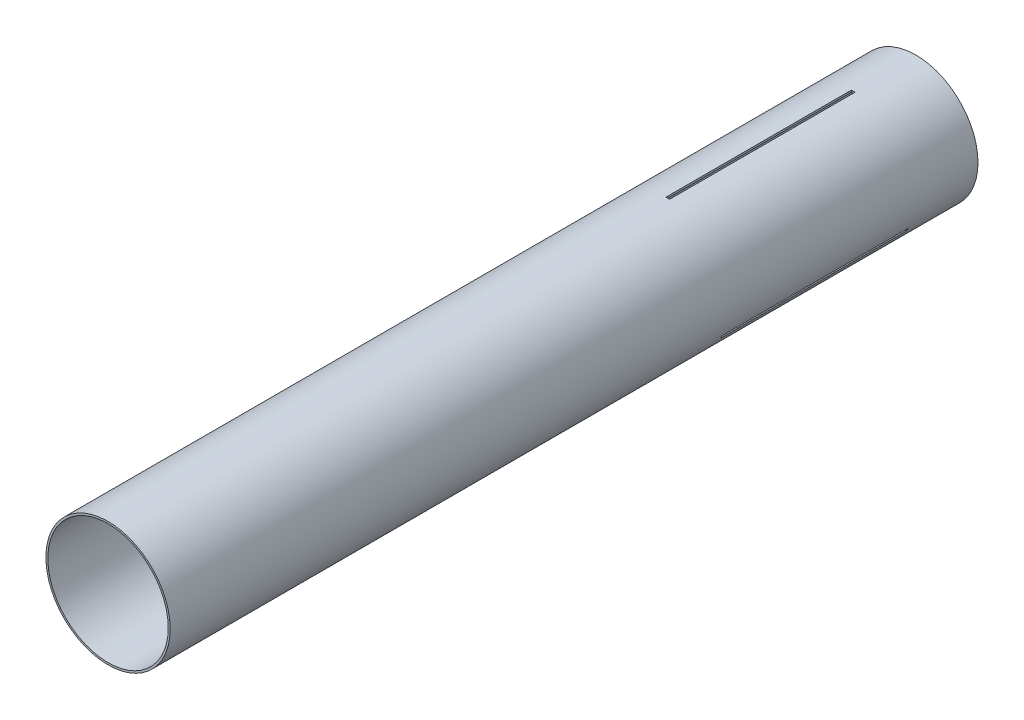
ISO-10303-21;
HEADER;
FILE_DESCRIPTION(('STEP AP214'),'2;1');
FILE_NAME('part.step','',(''),(''),'','','');
FILE_SCHEMA(('AUTOMOTIVE_DESIGN { 1 0 10303 214 1 1 1 1 }'));
ENDSEC;
DATA;
#1=APPLICATION_CONTEXT('core data for automotive mechanical design processes');
#2=APPLICATION_PROTOCOL_DEFINITION('international standard','automotive_design',2000,#1);
#3=PRODUCT_CONTEXT('',#1,'mechanical');
#4=PRODUCT('Part','Part','',(#3));
#5=PRODUCT_RELATED_PRODUCT_CATEGORY('part','',(#4));
#6=PRODUCT_DEFINITION_FORMATION('','',#4);
#7=PRODUCT_DEFINITION_CONTEXT('part definition',#1,'design');
#8=PRODUCT_DEFINITION('design','',#6,#7);
#9=PRODUCT_DEFINITION_SHAPE('','',#8);
#10=(LENGTH_UNIT() NAMED_UNIT(*) SI_UNIT(.MILLI.,.METRE.));
#11=(NAMED_UNIT(*) PLANE_ANGLE_UNIT() SI_UNIT($,.RADIAN.));
#12=(NAMED_UNIT(*) SI_UNIT($,.STERADIAN.) SOLID_ANGLE_UNIT());
#13=UNCERTAINTY_MEASURE_WITH_UNIT(LENGTH_MEASURE(1.E-05),#10,'distance_accuracy_value','');
#14=(GEOMETRIC_REPRESENTATION_CONTEXT(3) GLOBAL_UNCERTAINTY_ASSIGNED_CONTEXT((#13)) GLOBAL_UNIT_ASSIGNED_CONTEXT((#10,
#11,#12)) REPRESENTATION_CONTEXT('',''));
#15=CARTESIAN_POINT('',(0.,0.,0.));
#16=DIRECTION('',(0.,0.,1.));
#17=DIRECTION('',(1.,0.,0.));
#18=AXIS2_PLACEMENT_3D('',#15,#16,#17);
#19=CARTESIAN_POINT('',(0.,0.,660.4));
#20=DIRECTION('',(0.,0.,-1.));
#21=DIRECTION('',(-1.,0.,0.));
#22=AXIS2_PLACEMENT_3D('',#19,#20,#21);
#23=CYLINDRICAL_SURFACE('',#22,50.8);
#24=CARTESIAN_POINT('',(0.,0.,0.));
#25=DIRECTION('',(0.,0.,1.));
#26=DIRECTION('',(1.,0.,0.));
#27=AXIS2_PLACEMENT_3D('',#24,#25,#26);
#28=CIRCLE('',#27,50.8);
#29=CARTESIAN_POINT('',(50.8,0.,0.));
#30=VERTEX_POINT('',#29);
#31=EDGE_CURVE('E178',#30,#30,#28,.T.);
#32=ORIENTED_EDGE('',*,*,#31,.T.);
#33=EDGE_LOOP('',(#32));
#34=FACE_BOUND('',#33,.T.);
#35=CARTESIAN_POINT('',(0.,0.,660.4));
#36=DIRECTION('',(0.,0.,1.));
#37=DIRECTION('',(1.,0.,0.));
#38=AXIS2_PLACEMENT_3D('',#35,#36,#37);
#39=CIRCLE('',#38,50.8);
#40=CARTESIAN_POINT('',(50.8,0.,660.4));
#41=VERTEX_POINT('',#40);
#42=EDGE_CURVE('E181',#41,#41,#39,.T.);
#43=ORIENTED_EDGE('',*,*,#42,.F.);
#44=EDGE_LOOP('',(#43));
#45=FACE_BOUND('',#44,.T.);
#46=DIRECTION('',(0.,0.,-1.));
#47=VECTOR('',#46,1.);
#48=CARTESIAN_POINT('',(-44.7242434170221,-24.0911197492967,660.4));
#49=LINE('',#48,#47);
#50=CARTESIAN_POINT('',(-44.7242434170221,-24.0911197492967,202.8063));
#51=VERTEX_POINT('',#50);
#52=CARTESIAN_POINT('',(-44.7242434170221,-24.0911197492967,51.1937));
#53=VERTEX_POINT('',#52);
#54=EDGE_CURVE('E151',#51,#53,#49,.T.);
#55=ORIENTED_EDGE('',*,*,#54,.F.);
#56=CARTESIAN_POINT('',(0.,0.,202.8063));
#57=DIRECTION('',(0.,0.,1.));
#58=DIRECTION('',(1.,0.,0.));
#59=AXIS2_PLACEMENT_3D('',#56,#57,#58);
#60=CIRCLE('',#59,50.8);
#61=CARTESIAN_POINT('',(-43.2256434170225,-26.6867710895196,202.8063));
#62=VERTEX_POINT('',#61);
#63=EDGE_CURVE('E136',#51,#62,#60,.T.);
#64=ORIENTED_EDGE('',*,*,#63,.T.);
#65=DIRECTION('',(0.,0.,-1.));
#66=VECTOR('',#65,1.);
#67=CARTESIAN_POINT('',(-43.2256434170225,-26.6867710895196,660.4));
#68=LINE('',#67,#66);
#69=CARTESIAN_POINT('',(-43.2256434170225,-26.6867710895196,51.1937));
#70=VERTEX_POINT('',#69);
#71=EDGE_CURVE('E142',#70,#62,#68,.F.);
#72=ORIENTED_EDGE('',*,*,#71,.F.);
#73=CARTESIAN_POINT('',(0.,0.,51.1937));
#74=DIRECTION('',(0.,0.,1.));
#75=DIRECTION('',(1.,0.,0.));
#76=AXIS2_PLACEMENT_3D('',#73,#74,#75);
#77=CIRCLE('',#76,50.8);
#78=EDGE_CURVE('E125',#53,#70,#77,.T.);
#79=ORIENTED_EDGE('',*,*,#78,.F.);
#80=EDGE_LOOP('',(#55,#64,#72,#79));
#81=FACE_BOUND('',#80,.T.);
#82=DIRECTION('',(0.,0.,-1.));
#83=VECTOR('',#82,1.);
#84=CARTESIAN_POINT('',(43.2256434170179,-26.6867710895271,660.4));
#85=LINE('',#84,#83);
#86=CARTESIAN_POINT('',(43.2256434170179,-26.6867710895271,202.8063));
#87=VERTEX_POINT('',#86);
#88=CARTESIAN_POINT('',(43.2256434170179,-26.6867710895271,51.1937));
#89=VERTEX_POINT('',#88);
#90=EDGE_CURVE('E163',#87,#89,#85,.T.);
#91=ORIENTED_EDGE('',*,*,#90,.F.);
#92=CARTESIAN_POINT('',(0.,0.,202.8063));
#93=DIRECTION('',(0.,0.,1.));
#94=DIRECTION('',(1.,0.,0.));
#95=AXIS2_PLACEMENT_3D('',#92,#93,#94);
#96=CIRCLE('',#95,50.8);
#97=CARTESIAN_POINT('',(44.7242434170179,-24.0911197493044,202.8063));
#98=VERTEX_POINT('',#97);
#99=EDGE_CURVE('E158',#87,#98,#96,.T.);
#100=ORIENTED_EDGE('',*,*,#99,.T.);
#101=DIRECTION('',(0.,0.,-1.));
#102=VECTOR('',#101,1.);
#103=CARTESIAN_POINT('',(44.7242434170179,-24.0911197493045,660.4));
#104=LINE('',#103,#102);
#105=CARTESIAN_POINT('',(44.7242434170179,-24.0911197493044,51.1937));
#106=VERTEX_POINT('',#105);
#107=EDGE_CURVE('E161',#106,#98,#104,.F.);
#108=ORIENTED_EDGE('',*,*,#107,.F.);
#109=CARTESIAN_POINT('',(0.,0.,51.1937));
#110=DIRECTION('',(0.,0.,1.));
#111=DIRECTION('',(1.,0.,0.));
#112=AXIS2_PLACEMENT_3D('',#109,#110,#111);
#113=CIRCLE('',#112,50.8);
#114=EDGE_CURVE('E153',#89,#106,#113,.T.);
#115=ORIENTED_EDGE('',*,*,#114,.F.);
#116=EDGE_LOOP('',(#91,#100,#108,#115));
#117=FACE_BOUND('',#116,.T.);
#118=CARTESIAN_POINT('',(0.,0.,202.8063));
#119=DIRECTION('',(0.,0.,-1.));
#120=DIRECTION('',(-1.,0.,0.));
#121=AXIS2_PLACEMENT_3D('',#118,#119,#120);
#122=CIRCLE('',#121,50.8);
#123=CARTESIAN_POINT('',(-1.4986,50.7778908388287,202.8063));
#124=VERTEX_POINT('',#123);
#125=CARTESIAN_POINT('',(1.4986,50.7778908388287,202.8063));
#126=VERTEX_POINT('',#125);
#127=EDGE_CURVE('E168',#124,#126,#122,.T.);
#128=ORIENTED_EDGE('',*,*,#127,.F.);
#129=DIRECTION('',(0.,0.,-1.));
#130=VECTOR('',#129,1.);
#131=CARTESIAN_POINT('',(-1.4986,50.7778908388287,660.4));
#132=LINE('',#131,#130);
#133=CARTESIAN_POINT('',(-1.4986,50.7778908388287,51.1937));
#134=VERTEX_POINT('',#133);
#135=EDGE_CURVE('E172',#134,#124,#132,.F.);
#136=ORIENTED_EDGE('',*,*,#135,.F.);
#137=CARTESIAN_POINT('',(0.,0.,51.1937));
#138=DIRECTION('',(0.,0.,-1.));
#139=DIRECTION('',(-1.,0.,0.));
#140=AXIS2_PLACEMENT_3D('',#137,#138,#139);
#141=CIRCLE('',#140,50.8);
#142=CARTESIAN_POINT('',(1.4986,50.7778908388287,51.1937));
#143=VERTEX_POINT('',#142);
#144=EDGE_CURVE('E165',#134,#143,#141,.T.);
#145=ORIENTED_EDGE('',*,*,#144,.T.);
#146=DIRECTION('',(0.,0.,-1.));
#147=VECTOR('',#146,1.);
#148=CARTESIAN_POINT('',(1.4986,50.7778908388287,660.4));
#149=LINE('',#148,#147);
#150=EDGE_CURVE('E170',#126,#143,#149,.T.);
#151=ORIENTED_EDGE('',*,*,#150,.F.);
#152=EDGE_LOOP('',(#128,#136,#145,#151));
#153=FACE_BOUND('',#152,.T.);
#154=ADVANCED_FACE('F38',(#34,#45,#81,#117,#153),#23,.T.);
#155=CARTESIAN_POINT('',(0.,0.,660.4));
#156=DIRECTION('',(0.,0.,-1.));
#157=DIRECTION('',(-1.,0.,0.));
#158=AXIS2_PLACEMENT_3D('',#155,#156,#157);
#159=CYLINDRICAL_SURFACE('',#158,49.2125);
#160=CARTESIAN_POINT('',(0.,0.,202.8063));
#161=DIRECTION('',(0.,0.,1.));
#162=DIRECTION('',(1.,0.,0.));
#163=AXIS2_PLACEMENT_3D('',#160,#161,#162);
#164=CIRCLE('',#163,49.2125);
#165=CARTESIAN_POINT('',(41.8502101581865,-25.8926643272883,202.8063));
#166=VERTEX_POINT('',#165);
#167=CARTESIAN_POINT('',(43.3488101581866,-23.2970129870656,202.8063));
#168=VERTEX_POINT('',#167);
#169=EDGE_CURVE('E203',#166,#168,#164,.T.);
#170=ORIENTED_EDGE('',*,*,#169,.F.);
#171=DIRECTION('',(0.,0.,-1.));
#172=VECTOR('',#171,1.);
#173=CARTESIAN_POINT('',(41.8502101581865,-25.8926643272883,660.4));
#174=LINE('',#173,#172);
#175=CARTESIAN_POINT('',(41.8502101581865,-25.8926643272883,51.1937));
#176=VERTEX_POINT('',#175);
#177=EDGE_CURVE('E200',#166,#176,#174,.T.);
#178=ORIENTED_EDGE('',*,*,#177,.T.);
#179=CARTESIAN_POINT('',(0.,0.,51.1937));
#180=DIRECTION('',(0.,0.,1.));
#181=DIRECTION('',(1.,0.,0.));
#182=AXIS2_PLACEMENT_3D('',#179,#180,#181);
#183=CIRCLE('',#182,49.2125);
#184=CARTESIAN_POINT('',(43.3488101581866,-23.2970129870656,51.1937));
#185=VERTEX_POINT('',#184);
#186=EDGE_CURVE('E194',#176,#185,#183,.T.);
#187=ORIENTED_EDGE('',*,*,#186,.T.);
#188=DIRECTION('',(0.,0.,-1.));
#189=VECTOR('',#188,1.);
#190=CARTESIAN_POINT('',(43.3488101581866,-23.2970129870656,660.4));
#191=LINE('',#190,#189);
#192=EDGE_CURVE('E197',#185,#168,#191,.F.);
#193=ORIENTED_EDGE('',*,*,#192,.T.);
#194=EDGE_LOOP('',(#170,#178,#187,#193));
#195=FACE_BOUND('',#194,.T.);
#196=CARTESIAN_POINT('',(0.,0.,202.8063));
#197=DIRECTION('',(0.,0.,1.));
#198=DIRECTION('',(1.,0.,0.));
#199=AXIS2_PLACEMENT_3D('',#196,#197,#198);
#200=CIRCLE('',#199,49.2125);
#201=CARTESIAN_POINT('',(-43.3488101581905,-23.2970129870583,202.8063));
#202=VERTEX_POINT('',#201);
#203=CARTESIAN_POINT('',(-41.8502101581908,-25.8926643272812,202.8063));
#204=VERTEX_POINT('',#203);
#205=EDGE_CURVE('E192',#202,#204,#200,.T.);
#206=ORIENTED_EDGE('',*,*,#205,.F.);
#207=DIRECTION('',(0.,0.,-1.));
#208=VECTOR('',#207,1.);
#209=CARTESIAN_POINT('',(-43.3488101581905,-23.2970129870583,660.4));
#210=LINE('',#209,#208);
#211=CARTESIAN_POINT('',(-43.3488101581905,-23.2970129870583,51.1937));
#212=VERTEX_POINT('',#211);
#213=EDGE_CURVE('E189',#202,#212,#210,.T.);
#214=ORIENTED_EDGE('',*,*,#213,.T.);
#215=CARTESIAN_POINT('',(0.,0.,51.1937));
#216=DIRECTION('',(0.,0.,1.));
#217=DIRECTION('',(1.,0.,0.));
#218=AXIS2_PLACEMENT_3D('',#215,#216,#217);
#219=CIRCLE('',#218,49.2125);
#220=CARTESIAN_POINT('',(-41.8502101581908,-25.8926643272812,51.1937));
#221=VERTEX_POINT('',#220);
#222=EDGE_CURVE('E184',#212,#221,#219,.T.);
#223=ORIENTED_EDGE('',*,*,#222,.T.);
#224=DIRECTION('',(0.,0.,-1.));
#225=VECTOR('',#224,1.);
#226=CARTESIAN_POINT('',(-41.8502101581908,-25.8926643272812,660.4));
#227=LINE('',#226,#225);
#228=EDGE_CURVE('E145',#221,#204,#227,.F.);
#229=ORIENTED_EDGE('',*,*,#228,.T.);
#230=EDGE_LOOP('',(#206,#214,#223,#229));
#231=FACE_BOUND('',#230,.T.);
#232=CARTESIAN_POINT('',(0.,0.,660.4));
#233=DIRECTION('',(0.,0.,1.));
#234=DIRECTION('',(1.,0.,0.));
#235=AXIS2_PLACEMENT_3D('',#232,#233,#234);
#236=CIRCLE('',#235,49.2125);
#237=CARTESIAN_POINT('',(49.2125,0.,660.4));
#238=VERTEX_POINT('',#237);
#239=EDGE_CURVE('E175',#238,#238,#236,.T.);
#240=ORIENTED_EDGE('',*,*,#239,.T.);
#241=EDGE_LOOP('',(#240));
#242=FACE_BOUND('',#241,.T.);
#243=CARTESIAN_POINT('',(0.,0.,0.));
#244=DIRECTION('',(0.,0.,1.));
#245=DIRECTION('',(1.,0.,0.));
#246=AXIS2_PLACEMENT_3D('',#243,#244,#245);
#247=CIRCLE('',#246,49.2125);
#248=CARTESIAN_POINT('',(49.2125,0.,0.));
#249=VERTEX_POINT('',#248);
#250=EDGE_CURVE('E174',#249,#249,#247,.T.);
#251=ORIENTED_EDGE('',*,*,#250,.F.);
#252=EDGE_LOOP('',(#251));
#253=FACE_BOUND('',#252,.T.);
#254=DIRECTION('',(0.,0.,-1.));
#255=VECTOR('',#254,1.);
#256=CARTESIAN_POINT('',(-1.4986,49.1896773143512,660.4));
#257=LINE('',#256,#255);
#258=CARTESIAN_POINT('',(-1.4986,49.1896773143512,51.1937));
#259=VERTEX_POINT('',#258);
#260=CARTESIAN_POINT('',(-1.4986,49.1896773143512,202.8063));
#261=VERTEX_POINT('',#260);
#262=EDGE_CURVE('E45',#259,#261,#257,.F.);
#263=ORIENTED_EDGE('',*,*,#262,.T.);
#264=CARTESIAN_POINT('',(0.,0.,202.8063));
#265=DIRECTION('',(0.,0.,-1.));
#266=DIRECTION('',(-1.,0.,0.));
#267=AXIS2_PLACEMENT_3D('',#264,#265,#266);
#268=CIRCLE('',#267,49.2125);
#269=CARTESIAN_POINT('',(1.4986,49.1896773143512,202.8063));
#270=VERTEX_POINT('',#269);
#271=EDGE_CURVE('E11',#261,#270,#268,.T.);
#272=ORIENTED_EDGE('',*,*,#271,.T.);
#273=DIRECTION('',(0.,0.,-1.));
#274=VECTOR('',#273,1.);
#275=CARTESIAN_POINT('',(1.4986,49.1896773143512,660.4));
#276=LINE('',#275,#274);
#277=CARTESIAN_POINT('',(1.4986,49.1896773143512,51.1937));
#278=VERTEX_POINT('',#277);
#279=EDGE_CURVE('E207',#270,#278,#276,.T.);
#280=ORIENTED_EDGE('',*,*,#279,.T.);
#281=CARTESIAN_POINT('',(0.,0.,51.1937));
#282=DIRECTION('',(0.,0.,-1.));
#283=DIRECTION('',(-1.,0.,0.));
#284=AXIS2_PLACEMENT_3D('',#281,#282,#283);
#285=CIRCLE('',#284,49.2125);
#286=EDGE_CURVE('E205',#259,#278,#285,.T.);
#287=ORIENTED_EDGE('',*,*,#286,.F.);
#288=EDGE_LOOP('',(#263,#272,#280,#287));
#289=FACE_BOUND('',#288,.T.);
#290=ADVANCED_FACE('F213',(#195,#231,#242,#253,#289),#159,.F.);
#291=CARTESIAN_POINT('',(0.,0.,660.4));
#292=DIRECTION('',(0.,0.,1.));
#293=DIRECTION('',(1.,0.,0.));
#294=AXIS2_PLACEMENT_3D('',#291,#292,#293);
#295=PLANE('',#294);
#296=ORIENTED_EDGE('',*,*,#42,.T.);
#297=EDGE_LOOP('',(#296));
#298=FACE_BOUND('',#297,.T.);
#299=ORIENTED_EDGE('',*,*,#239,.F.);
#300=EDGE_LOOP('',(#299));
#301=FACE_BOUND('',#300,.T.);
#302=ADVANCED_FACE('F266',(#298,#301),#295,.T.);
#303=CARTESIAN_POINT('',(0.,0.,0.));
#304=DIRECTION('',(0.,0.,1.));
#305=DIRECTION('',(1.,0.,0.));
#306=AXIS2_PLACEMENT_3D('',#303,#304,#305);
#307=PLANE('',#306);
#308=ORIENTED_EDGE('',*,*,#31,.F.);
#309=EDGE_LOOP('',(#308));
#310=FACE_BOUND('',#309,.T.);
#311=ORIENTED_EDGE('',*,*,#250,.T.);
#312=EDGE_LOOP('',(#311));
#313=FACE_BOUND('',#312,.T.);
#314=ADVANCED_FACE('F275',(#310,#313),#307,.F.);
#315=CARTESIAN_POINT('',(-55.7419131403146,-30.4521743298788,202.8063));
#316=DIRECTION('',(0.499999999999808,-0.866025403784549,0.));
#317=DIRECTION('',(0.866025403784549,0.499999999999808,0.));
#318=AXIS2_PLACEMENT_3D('',#315,#316,#317);
#319=PLANE('',#318);
#320=ORIENTED_EDGE('',*,*,#54,.T.);
#321=DIRECTION('',(-0.866025403784549,-0.499999999999808,0.));
#322=VECTOR('',#321,1.);
#323=CARTESIAN_POINT('',(-55.7419131403146,-30.4521743298788,51.1937));
#324=LINE('',#323,#322);
#325=EDGE_CURVE('E131',#212,#53,#324,.T.);
#326=ORIENTED_EDGE('',*,*,#325,.F.);
#327=ORIENTED_EDGE('',*,*,#213,.F.);
#328=DIRECTION('',(-0.866025403784549,-0.499999999999808,0.));
#329=VECTOR('',#328,1.);
#330=CARTESIAN_POINT('',(-55.7419131403146,-30.4521743298788,202.8063));
#331=LINE('',#330,#329);
#332=EDGE_CURVE('E147',#202,#51,#331,.T.);
#333=ORIENTED_EDGE('',*,*,#332,.T.);
#334=EDGE_LOOP('',(#320,#326,#327,#333));
#335=FACE_BOUND('',#334,.T.);
#336=ADVANCED_FACE('F248',(#335),#319,.T.);
#337=CARTESIAN_POINT('',(-54.2433131403152,-33.0478256701018,202.8063));
#338=DIRECTION('',(-0.499999999999808,0.86602540378455,0.));
#339=DIRECTION('',(-0.86602540378455,-0.499999999999808,0.));
#340=AXIS2_PLACEMENT_3D('',#337,#338,#339);
#341=PLANE('',#340);
#342=ORIENTED_EDGE('',*,*,#71,.T.);
#343=DIRECTION('',(0.86602540378455,0.499999999999808,0.));
#344=VECTOR('',#343,1.);
#345=CARTESIAN_POINT('',(-54.2433131403152,-33.0478256701018,202.8063));
#346=LINE('',#345,#344);
#347=EDGE_CURVE('E238',#62,#204,#346,.T.);
#348=ORIENTED_EDGE('',*,*,#347,.T.);
#349=ORIENTED_EDGE('',*,*,#228,.F.);
#350=DIRECTION('',(0.86602540378455,0.499999999999808,0.));
#351=VECTOR('',#350,1.);
#352=CARTESIAN_POINT('',(-54.2433131403152,-33.0478256701018,51.1937));
#353=LINE('',#352,#351);
#354=EDGE_CURVE('E128',#70,#221,#353,.T.);
#355=ORIENTED_EDGE('',*,*,#354,.F.);
#356=EDGE_LOOP('',(#342,#348,#349,#355));
#357=FACE_BOUND('',#356,.T.);
#358=ADVANCED_FACE('F140',(#357),#341,.T.);
#359=CARTESIAN_POINT('',(0.,0.,202.8063));
#360=DIRECTION('',(0.,0.,1.));
#361=DIRECTION('',(1.,0.,0.));
#362=AXIS2_PLACEMENT_3D('',#359,#360,#361);
#363=PLANE('',#362);
#364=ORIENTED_EDGE('',*,*,#332,.F.);
#365=ORIENTED_EDGE('',*,*,#205,.T.);
#366=ORIENTED_EDGE('',*,*,#347,.F.);
#367=ORIENTED_EDGE('',*,*,#63,.F.);
#368=EDGE_LOOP('',(#364,#365,#366,#367));
#369=FACE_BOUND('',#368,.T.);
#370=ADVANCED_FACE('F250',(#369),#363,.F.);
#371=CARTESIAN_POINT('',(0.,0.,51.1937));
#372=DIRECTION('',(0.,0.,1.));
#373=DIRECTION('',(1.,0.,0.));
#374=AXIS2_PLACEMENT_3D('',#371,#372,#373);
#375=PLANE('',#374);
#376=ORIENTED_EDGE('',*,*,#78,.T.);
#377=ORIENTED_EDGE('',*,*,#354,.T.);
#378=ORIENTED_EDGE('',*,*,#222,.F.);
#379=ORIENTED_EDGE('',*,*,#325,.T.);
#380=EDGE_LOOP('',(#376,#377,#378,#379));
#381=FACE_BOUND('',#380,.T.);
#382=ADVANCED_FACE('F127',(#381),#375,.T.);
#383=CARTESIAN_POINT('',(54.2433131403123,-33.0478256701152,202.8063));
#384=DIRECTION('',(0.500000000000096,0.866025403784383,0.));
#385=DIRECTION('',(-0.866025403784383,0.500000000000096,0.));
#386=AXIS2_PLACEMENT_3D('',#383,#384,#385);
#387=PLANE('',#386);
#388=ORIENTED_EDGE('',*,*,#90,.T.);
#389=DIRECTION('',(0.866025403784383,-0.500000000000096,0.));
#390=VECTOR('',#389,1.);
#391=CARTESIAN_POINT('',(54.2433131403123,-33.0478256701152,51.1937));
#392=LINE('',#391,#390);
#393=EDGE_CURVE('E60',#176,#89,#392,.T.);
#394=ORIENTED_EDGE('',*,*,#393,.F.);
#395=ORIENTED_EDGE('',*,*,#177,.F.);
#396=DIRECTION('',(0.866025403784383,-0.500000000000096,0.));
#397=VECTOR('',#396,1.);
#398=CARTESIAN_POINT('',(54.2433131403123,-33.0478256701152,202.8063));
#399=LINE('',#398,#397);
#400=EDGE_CURVE('E231',#166,#87,#399,.T.);
#401=ORIENTED_EDGE('',*,*,#400,.T.);
#402=EDGE_LOOP('',(#388,#394,#395,#401));
#403=FACE_BOUND('',#402,.T.);
#404=ADVANCED_FACE('F257',(#403),#387,.T.);
#405=CARTESIAN_POINT('',(55.7419131403126,-30.4521743298926,202.8063));
#406=DIRECTION('',(-0.500000000000096,-0.866025403784383,0.));
#407=DIRECTION('',(0.866025403784383,-0.500000000000096,0.));
#408=AXIS2_PLACEMENT_3D('',#405,#406,#407);
#409=PLANE('',#408);
#410=ORIENTED_EDGE('',*,*,#107,.T.);
#411=DIRECTION('',(-0.866025403784383,0.500000000000096,0.));
#412=VECTOR('',#411,1.);
#413=CARTESIAN_POINT('',(55.7419131403126,-30.4521743298926,202.8063));
#414=LINE('',#413,#412);
#415=EDGE_CURVE('E229',#98,#168,#414,.T.);
#416=ORIENTED_EDGE('',*,*,#415,.T.);
#417=ORIENTED_EDGE('',*,*,#192,.F.);
#418=DIRECTION('',(-0.866025403784383,0.500000000000096,0.));
#419=VECTOR('',#418,1.);
#420=CARTESIAN_POINT('',(55.7419131403126,-30.4521743298926,51.1937));
#421=LINE('',#420,#419);
#422=EDGE_CURVE('E234',#106,#185,#421,.T.);
#423=ORIENTED_EDGE('',*,*,#422,.F.);
#424=EDGE_LOOP('',(#410,#416,#417,#423));
#425=FACE_BOUND('',#424,.T.);
#426=ADVANCED_FACE('F313',(#425),#409,.T.);
#427=CARTESIAN_POINT('',(0.,0.,202.8063));
#428=DIRECTION('',(0.,0.,1.));
#429=DIRECTION('',(1.,0.,0.));
#430=AXIS2_PLACEMENT_3D('',#427,#428,#429);
#431=PLANE('',#430);
#432=ORIENTED_EDGE('',*,*,#400,.F.);
#433=ORIENTED_EDGE('',*,*,#169,.T.);
#434=ORIENTED_EDGE('',*,*,#415,.F.);
#435=ORIENTED_EDGE('',*,*,#99,.F.);
#436=EDGE_LOOP('',(#432,#433,#434,#435));
#437=FACE_BOUND('',#436,.T.);
#438=ADVANCED_FACE('F322',(#437),#431,.F.);
#439=CARTESIAN_POINT('',(0.,0.,51.1937));
#440=DIRECTION('',(0.,0.,1.));
#441=DIRECTION('',(1.,0.,0.));
#442=AXIS2_PLACEMENT_3D('',#439,#440,#441);
#443=PLANE('',#442);
#444=ORIENTED_EDGE('',*,*,#114,.T.);
#445=ORIENTED_EDGE('',*,*,#422,.T.);
#446=ORIENTED_EDGE('',*,*,#186,.F.);
#447=ORIENTED_EDGE('',*,*,#393,.T.);
#448=EDGE_LOOP('',(#444,#445,#446,#447));
#449=FACE_BOUND('',#448,.T.);
#450=ADVANCED_FACE('F332',(#449),#443,.T.);
#451=CARTESIAN_POINT('',(-1.4986,63.5,202.8063));
#452=DIRECTION('',(1.,0.,0.));
#453=DIRECTION('',(0.,1.,0.));
#454=AXIS2_PLACEMENT_3D('',#451,#452,#453);
#455=PLANE('',#454);
#456=ORIENTED_EDGE('',*,*,#135,.T.);
#457=DIRECTION('',(0.,-1.,0.));
#458=VECTOR('',#457,1.);
#459=CARTESIAN_POINT('',(-1.4986,63.5,202.8063));
#460=LINE('',#459,#458);
#461=EDGE_CURVE('E221',#124,#261,#460,.T.);
#462=ORIENTED_EDGE('',*,*,#461,.T.);
#463=ORIENTED_EDGE('',*,*,#262,.F.);
#464=DIRECTION('',(0.,-1.,0.));
#465=VECTOR('',#464,1.);
#466=CARTESIAN_POINT('',(-1.4986,63.5,51.1937));
#467=LINE('',#466,#465);
#468=EDGE_CURVE('E218',#134,#259,#467,.T.);
#469=ORIENTED_EDGE('',*,*,#468,.F.);
#470=EDGE_LOOP('',(#456,#462,#463,#469));
#471=FACE_BOUND('',#470,.T.);
#472=ADVANCED_FACE('F217',(#471),#455,.T.);
#473=CARTESIAN_POINT('',(1.4986,63.5,202.8063));
#474=DIRECTION('',(-1.,0.,0.));
#475=DIRECTION('',(0.,-1.,0.));
#476=AXIS2_PLACEMENT_3D('',#473,#474,#475);
#477=PLANE('',#476);
#478=ORIENTED_EDGE('',*,*,#150,.T.);
#479=DIRECTION('',(0.,1.,0.));
#480=VECTOR('',#479,1.);
#481=CARTESIAN_POINT('',(1.4986,63.5,51.1937));
#482=LINE('',#481,#480);
#483=EDGE_CURVE('E52',#278,#143,#482,.T.);
#484=ORIENTED_EDGE('',*,*,#483,.F.);
#485=ORIENTED_EDGE('',*,*,#279,.F.);
#486=DIRECTION('',(0.,1.,0.));
#487=VECTOR('',#486,1.);
#488=CARTESIAN_POINT('',(1.4986,63.5,202.8063));
#489=LINE('',#488,#487);
#490=EDGE_CURVE('E137',#270,#126,#489,.T.);
#491=ORIENTED_EDGE('',*,*,#490,.T.);
#492=EDGE_LOOP('',(#478,#484,#485,#491));
#493=FACE_BOUND('',#492,.T.);
#494=ADVANCED_FACE('F350',(#493),#477,.T.);
#495=CARTESIAN_POINT('',(0.,0.,202.8063));
#496=DIRECTION('',(0.,0.,-1.));
#497=DIRECTION('',(-1.,0.,0.));
#498=AXIS2_PLACEMENT_3D('',#495,#496,#497);
#499=PLANE('',#498);
#500=ORIENTED_EDGE('',*,*,#127,.T.);
#501=ORIENTED_EDGE('',*,*,#490,.F.);
#502=ORIENTED_EDGE('',*,*,#271,.F.);
#503=ORIENTED_EDGE('',*,*,#461,.F.);
#504=EDGE_LOOP('',(#500,#501,#502,#503));
#505=FACE_BOUND('',#504,.T.);
#506=ADVANCED_FACE('F359',(#505),#499,.T.);
#507=CARTESIAN_POINT('',(0.,0.,51.1937));
#508=DIRECTION('',(0.,0.,-1.));
#509=DIRECTION('',(-1.,0.,0.));
#510=AXIS2_PLACEMENT_3D('',#507,#508,#509);
#511=PLANE('',#510);
#512=ORIENTED_EDGE('',*,*,#468,.T.);
#513=ORIENTED_EDGE('',*,*,#286,.T.);
#514=ORIENTED_EDGE('',*,*,#483,.T.);
#515=ORIENTED_EDGE('',*,*,#144,.F.);
#516=EDGE_LOOP('',(#512,#513,#514,#515));
#517=FACE_BOUND('',#516,.T.);
#518=ADVANCED_FACE('F369',(#517),#511,.F.);
#519=CLOSED_SHELL('',(#154,#290,#302,#314,#336,#358,#370,#382,#404,#426,#438,#450,#472,#494,
#506,#518));
#520=MANIFOLD_SOLID_BREP('B2',#519);
#521=ADVANCED_BREP_SHAPE_REPRESENTATION('',(#18,#520),#14);
#522=SHAPE_DEFINITION_REPRESENTATION(#9,#521);
ENDSEC;
END-ISO-10303-21;
